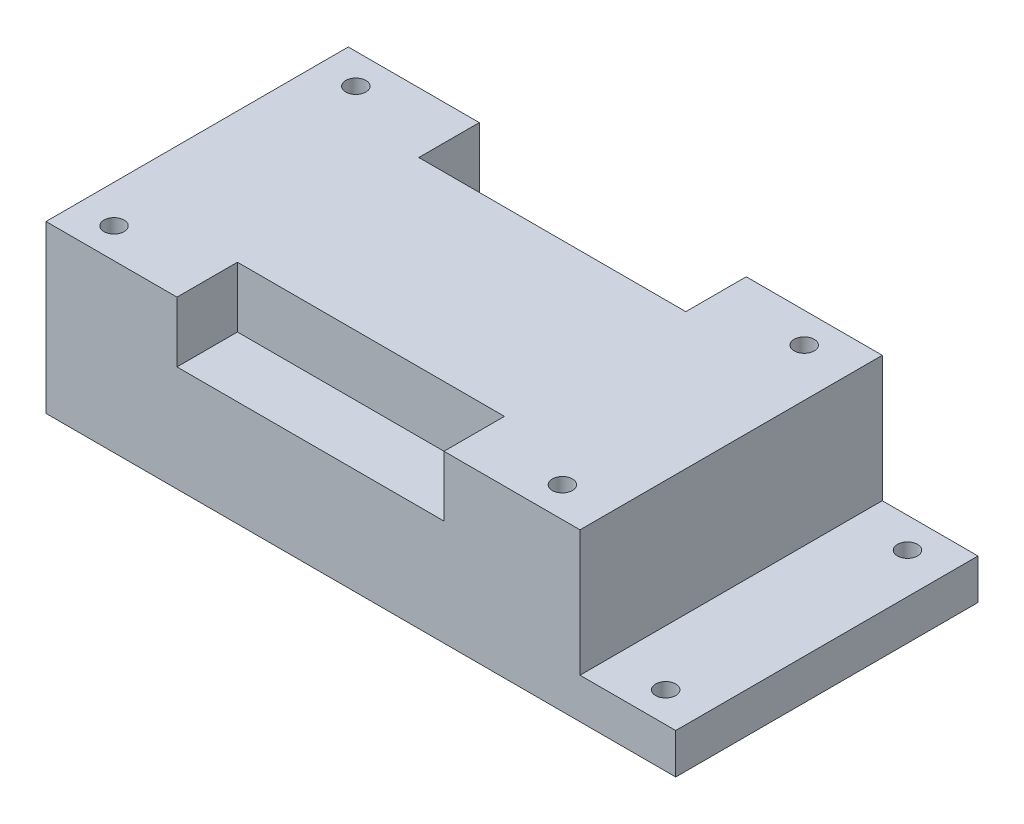
ISO-10303-21;
HEADER;
FILE_DESCRIPTION(('STEP AP214'),'2;1');
FILE_NAME('part.step','',(''),(''),'','','');
FILE_SCHEMA(('AUTOMOTIVE_DESIGN { 1 0 10303 214 1 1 1 1 }'));
ENDSEC;
DATA;
#1=APPLICATION_CONTEXT('core data for automotive mechanical design processes');
#2=APPLICATION_PROTOCOL_DEFINITION('international standard','automotive_design',2000,#1);
#3=PRODUCT_CONTEXT('',#1,'mechanical');
#4=PRODUCT('Part','Part','',(#3));
#5=PRODUCT_RELATED_PRODUCT_CATEGORY('part','',(#4));
#6=PRODUCT_DEFINITION_FORMATION('','',#4);
#7=PRODUCT_DEFINITION_CONTEXT('part definition',#1,'design');
#8=PRODUCT_DEFINITION('design','',#6,#7);
#9=PRODUCT_DEFINITION_SHAPE('','',#8);
#10=(LENGTH_UNIT() NAMED_UNIT(*) SI_UNIT(.MILLI.,.METRE.));
#11=(NAMED_UNIT(*) PLANE_ANGLE_UNIT() SI_UNIT($,.RADIAN.));
#12=(NAMED_UNIT(*) SI_UNIT($,.STERADIAN.) SOLID_ANGLE_UNIT());
#13=UNCERTAINTY_MEASURE_WITH_UNIT(LENGTH_MEASURE(1.E-05),#10,'distance_accuracy_value','');
#14=(GEOMETRIC_REPRESENTATION_CONTEXT(3) GLOBAL_UNCERTAINTY_ASSIGNED_CONTEXT((#13)) GLOBAL_UNIT_ASSIGNED_CONTEXT((#10,
#11,#12)) REPRESENTATION_CONTEXT('',''));
#15=CARTESIAN_POINT('',(0.,0.,0.));
#16=DIRECTION('',(0.,0.,1.));
#17=DIRECTION('',(1.,0.,0.));
#18=AXIS2_PLACEMENT_3D('',#15,#16,#17);
#19=CARTESIAN_POINT('',(16.5,33.,0.));
#20=DIRECTION('',(-1.,0.,0.));
#21=DIRECTION('',(0.,0.,1.));
#22=AXIS2_PLACEMENT_3D('',#19,#20,#21);
#23=PLANE('',#22);
#24=DIRECTION('',(0.,0.,-1.));
#25=VECTOR('',#24,1.);
#26=CARTESIAN_POINT('',(16.5,21.,0.));
#27=LINE('',#26,#25);
#28=CARTESIAN_POINT('',(16.5,21.,-18.));
#29=VERTEX_POINT('',#28);
#30=CARTESIAN_POINT('',(16.5,21.,-30.));
#31=VERTEX_POINT('',#30);
#32=EDGE_CURVE('E72',#29,#31,#27,.T.);
#33=ORIENTED_EDGE('',*,*,#32,.F.);
#34=DIRECTION('',(0.,-1.,0.));
#35=VECTOR('',#34,1.);
#36=CARTESIAN_POINT('',(16.5,33.,-18.));
#37=LINE('',#36,#35);
#38=CARTESIAN_POINT('',(16.5,33.,-18.));
#39=VERTEX_POINT('',#38);
#40=EDGE_CURVE('E11',#39,#29,#37,.T.);
#41=ORIENTED_EDGE('',*,*,#40,.F.);
#42=DIRECTION('',(0.,0.,-1.));
#43=VECTOR('',#42,1.);
#44=CARTESIAN_POINT('',(16.5,33.,0.));
#45=LINE('',#44,#43);
#46=CARTESIAN_POINT('',(16.5,33.,-30.));
#47=VERTEX_POINT('',#46);
#48=EDGE_CURVE('E226',#39,#47,#45,.T.);
#49=ORIENTED_EDGE('',*,*,#48,.T.);
#50=DIRECTION('',(0.,-1.,0.));
#51=VECTOR('',#50,1.);
#52=CARTESIAN_POINT('',(16.5,33.,-30.));
#53=LINE('',#52,#51);
#54=EDGE_CURVE('E294',#47,#31,#53,.T.);
#55=ORIENTED_EDGE('',*,*,#54,.T.);
#56=EDGE_LOOP('',(#33,#41,#49,#55));
#57=FACE_BOUND('',#56,.T.);
#58=ADVANCED_FACE('F50',(#57),#23,.T.);
#59=CARTESIAN_POINT('',(0.,33.,-18.));
#60=DIRECTION('',(0.,0.,-1.));
#61=DIRECTION('',(-1.,0.,0.));
#62=AXIS2_PLACEMENT_3D('',#59,#60,#61);
#63=PLANE('',#62);
#64=DIRECTION('',(1.,0.,0.));
#65=VECTOR('',#64,1.);
#66=CARTESIAN_POINT('',(0.,21.,-18.));
#67=LINE('',#66,#65);
#68=CARTESIAN_POINT('',(-36.5,21.,-18.));
#69=VERTEX_POINT('',#68);
#70=EDGE_CURVE('E177',#69,#29,#67,.T.);
#71=ORIENTED_EDGE('',*,*,#70,.F.);
#72=DIRECTION('',(0.,-1.,0.));
#73=VECTOR('',#72,1.);
#74=CARTESIAN_POINT('',(-36.5,33.,-18.));
#75=LINE('',#74,#73);
#76=CARTESIAN_POINT('',(-36.5,33.,-18.));
#77=VERTEX_POINT('',#76);
#78=EDGE_CURVE('E57',#77,#69,#75,.T.);
#79=ORIENTED_EDGE('',*,*,#78,.F.);
#80=DIRECTION('',(1.,0.,0.));
#81=VECTOR('',#80,1.);
#82=CARTESIAN_POINT('',(0.,33.,-18.));
#83=LINE('',#82,#81);
#84=EDGE_CURVE('E233',#77,#39,#83,.T.);
#85=ORIENTED_EDGE('',*,*,#84,.T.);
#86=ORIENTED_EDGE('',*,*,#40,.T.);
#87=EDGE_LOOP('',(#71,#79,#85,#86));
#88=FACE_BOUND('',#87,.T.);
#89=ADVANCED_FACE('F337',(#88),#63,.T.);
#90=CARTESIAN_POINT('',(-36.5,33.,0.));
#91=DIRECTION('',(1.,0.,0.));
#92=DIRECTION('',(0.,0.,-1.));
#93=AXIS2_PLACEMENT_3D('',#90,#91,#92);
#94=PLANE('',#93);
#95=DIRECTION('',(0.,0.,1.));
#96=VECTOR('',#95,1.);
#97=CARTESIAN_POINT('',(-36.5,21.,0.));
#98=LINE('',#97,#96);
#99=CARTESIAN_POINT('',(-36.5,21.,-30.));
#100=VERTEX_POINT('',#99);
#101=EDGE_CURVE('E192',#100,#69,#98,.T.);
#102=ORIENTED_EDGE('',*,*,#101,.F.);
#103=DIRECTION('',(0.,-1.,0.));
#104=VECTOR('',#103,1.);
#105=CARTESIAN_POINT('',(-36.5,33.,-30.));
#106=LINE('',#105,#104);
#107=CARTESIAN_POINT('',(-36.5,33.,-30.));
#108=VERTEX_POINT('',#107);
#109=EDGE_CURVE('E326',#108,#100,#106,.T.);
#110=ORIENTED_EDGE('',*,*,#109,.F.);
#111=DIRECTION('',(0.,0.,1.));
#112=VECTOR('',#111,1.);
#113=CARTESIAN_POINT('',(-36.5,33.,0.));
#114=LINE('',#113,#112);
#115=EDGE_CURVE('E240',#108,#77,#114,.T.);
#116=ORIENTED_EDGE('',*,*,#115,.T.);
#117=ORIENTED_EDGE('',*,*,#78,.T.);
#118=EDGE_LOOP('',(#102,#110,#116,#117));
#119=FACE_BOUND('',#118,.T.);
#120=ADVANCED_FACE('F335',(#119),#94,.T.);
#121=CARTESIAN_POINT('',(-62.5,33.,0.));
#122=DIRECTION('',(-1.,0.,0.));
#123=DIRECTION('',(0.,0.,1.));
#124=AXIS2_PLACEMENT_3D('',#121,#122,#123);
#125=PLANE('',#124);
#126=DIRECTION('',(0.,0.,-1.));
#127=VECTOR('',#126,1.);
#128=CARTESIAN_POINT('',(-62.5,0.,0.));
#129=LINE('',#128,#127);
#130=CARTESIAN_POINT('',(-62.5,0.,30.));
#131=VERTEX_POINT('',#130);
#132=CARTESIAN_POINT('',(-62.5,0.,-30.));
#133=VERTEX_POINT('',#132);
#134=EDGE_CURVE('E287',#131,#133,#129,.T.);
#135=ORIENTED_EDGE('',*,*,#134,.F.);
#136=DIRECTION('',(0.,-1.,0.));
#137=VECTOR('',#136,1.);
#138=CARTESIAN_POINT('',(-62.5,33.,30.));
#139=LINE('',#138,#137);
#140=CARTESIAN_POINT('',(-62.5,33.,30.));
#141=VERTEX_POINT('',#140);
#142=EDGE_CURVE('E317',#141,#131,#139,.T.);
#143=ORIENTED_EDGE('',*,*,#142,.F.);
#144=DIRECTION('',(0.,0.,-1.));
#145=VECTOR('',#144,1.);
#146=CARTESIAN_POINT('',(-62.5,33.,0.));
#147=LINE('',#146,#145);
#148=CARTESIAN_POINT('',(-62.5,33.,-30.));
#149=VERTEX_POINT('',#148);
#150=EDGE_CURVE('E243',#141,#149,#147,.T.);
#151=ORIENTED_EDGE('',*,*,#150,.T.);
#152=DIRECTION('',(0.,-1.,0.));
#153=VECTOR('',#152,1.);
#154=CARTESIAN_POINT('',(-62.5,33.,-30.));
#155=LINE('',#154,#153);
#156=EDGE_CURVE('E325',#149,#133,#155,.T.);
#157=ORIENTED_EDGE('',*,*,#156,.T.);
#158=EDGE_LOOP('',(#135,#143,#151,#157));
#159=FACE_BOUND('',#158,.T.);
#160=ADVANCED_FACE('F427',(#159),#125,.T.);
#161=CARTESIAN_POINT('',(-36.5,33.,0.));
#162=DIRECTION('',(-1.,0.,0.));
#163=DIRECTION('',(0.,0.,1.));
#164=AXIS2_PLACEMENT_3D('',#161,#162,#163);
#165=PLANE('',#164);
#166=DIRECTION('',(0.,-1.,0.));
#167=VECTOR('',#166,1.);
#168=CARTESIAN_POINT('',(-36.5,33.,30.));
#169=LINE('',#168,#167);
#170=CARTESIAN_POINT('',(-36.5,33.,30.));
#171=VERTEX_POINT('',#170);
#172=CARTESIAN_POINT('',(-36.5,21.,30.));
#173=VERTEX_POINT('',#172);
#174=EDGE_CURVE('E312',#171,#173,#169,.T.);
#175=ORIENTED_EDGE('',*,*,#174,.T.);
#176=DIRECTION('',(0.,0.,-1.));
#177=VECTOR('',#176,1.);
#178=CARTESIAN_POINT('',(-36.5,21.,0.));
#179=LINE('',#178,#177);
#180=CARTESIAN_POINT('',(-36.5,21.,18.));
#181=VERTEX_POINT('',#180);
#182=EDGE_CURVE('E191',#173,#181,#179,.T.);
#183=ORIENTED_EDGE('',*,*,#182,.T.);
#184=DIRECTION('',(0.,-1.,0.));
#185=VECTOR('',#184,1.);
#186=CARTESIAN_POINT('',(-36.5,33.,18.));
#187=LINE('',#186,#185);
#188=CARTESIAN_POINT('',(-36.5,33.,18.));
#189=VERTEX_POINT('',#188);
#190=EDGE_CURVE('E313',#189,#181,#187,.T.);
#191=ORIENTED_EDGE('',*,*,#190,.F.);
#192=DIRECTION('',(0.,0.,-1.));
#193=VECTOR('',#192,1.);
#194=CARTESIAN_POINT('',(-36.5,33.,0.));
#195=LINE('',#194,#193);
#196=EDGE_CURVE('E255',#171,#189,#195,.T.);
#197=ORIENTED_EDGE('',*,*,#196,.F.);
#198=EDGE_LOOP('',(#175,#183,#191,#197));
#199=FACE_BOUND('',#198,.T.);
#200=ADVANCED_FACE('F422',(#199),#165,.F.);
#201=CARTESIAN_POINT('',(0.,33.,18.));
#202=DIRECTION('',(0.,0.,-1.));
#203=DIRECTION('',(-1.,0.,0.));
#204=AXIS2_PLACEMENT_3D('',#201,#202,#203);
#205=PLANE('',#204);
#206=ORIENTED_EDGE('',*,*,#190,.T.);
#207=DIRECTION('',(1.,0.,0.));
#208=VECTOR('',#207,1.);
#209=CARTESIAN_POINT('',(0.,21.,18.));
#210=LINE('',#209,#208);
#211=CARTESIAN_POINT('',(16.5,21.,18.));
#212=VERTEX_POINT('',#211);
#213=EDGE_CURVE('E188',#181,#212,#210,.T.);
#214=ORIENTED_EDGE('',*,*,#213,.T.);
#215=DIRECTION('',(0.,-1.,0.));
#216=VECTOR('',#215,1.);
#217=CARTESIAN_POINT('',(16.5,33.,18.));
#218=LINE('',#217,#216);
#219=CARTESIAN_POINT('',(16.5,33.,18.));
#220=VERTEX_POINT('',#219);
#221=EDGE_CURVE('E307',#220,#212,#218,.T.);
#222=ORIENTED_EDGE('',*,*,#221,.F.);
#223=DIRECTION('',(1.,0.,0.));
#224=VECTOR('',#223,1.);
#225=CARTESIAN_POINT('',(0.,33.,18.));
#226=LINE('',#225,#224);
#227=EDGE_CURVE('E259',#189,#220,#226,.T.);
#228=ORIENTED_EDGE('',*,*,#227,.F.);
#229=EDGE_LOOP('',(#206,#214,#222,#228));
#230=FACE_BOUND('',#229,.T.);
#231=ADVANCED_FACE('F425',(#230),#205,.F.);
#232=CARTESIAN_POINT('',(16.5,33.,0.));
#233=DIRECTION('',(1.,0.,0.));
#234=DIRECTION('',(0.,0.,-1.));
#235=AXIS2_PLACEMENT_3D('',#232,#233,#234);
#236=PLANE('',#235);
#237=ORIENTED_EDGE('',*,*,#221,.T.);
#238=DIRECTION('',(0.,0.,1.));
#239=VECTOR('',#238,1.);
#240=CARTESIAN_POINT('',(16.5,21.,0.));
#241=LINE('',#240,#239);
#242=CARTESIAN_POINT('',(16.5,21.,30.));
#243=VERTEX_POINT('',#242);
#244=EDGE_CURVE('E187',#212,#243,#241,.T.);
#245=ORIENTED_EDGE('',*,*,#244,.T.);
#246=DIRECTION('',(0.,-1.,0.));
#247=VECTOR('',#246,1.);
#248=CARTESIAN_POINT('',(16.5,33.,30.));
#249=LINE('',#248,#247);
#250=CARTESIAN_POINT('',(16.5,33.,30.));
#251=VERTEX_POINT('',#250);
#252=EDGE_CURVE('E303',#251,#243,#249,.T.);
#253=ORIENTED_EDGE('',*,*,#252,.F.);
#254=DIRECTION('',(0.,0.,1.));
#255=VECTOR('',#254,1.);
#256=CARTESIAN_POINT('',(16.5,33.,0.));
#257=LINE('',#256,#255);
#258=EDGE_CURVE('E263',#220,#251,#257,.T.);
#259=ORIENTED_EDGE('',*,*,#258,.F.);
#260=EDGE_LOOP('',(#237,#245,#253,#259));
#261=FACE_BOUND('',#260,.T.);
#262=ADVANCED_FACE('F416',(#261),#236,.F.);
#263=CARTESIAN_POINT('',(0.,33.,30.));
#264=DIRECTION('',(0.,0.,-1.));
#265=DIRECTION('',(-1.,0.,0.));
#266=AXIS2_PLACEMENT_3D('',#263,#264,#265);
#267=PLANE('',#266);
#268=DIRECTION('',(1.,0.,0.));
#269=VECTOR('',#268,1.);
#270=CARTESIAN_POINT('',(0.,0.,30.));
#271=LINE('',#270,#269);
#272=CARTESIAN_POINT('',(62.5,0.,30.));
#273=VERTEX_POINT('',#272);
#274=EDGE_CURVE('E174',#131,#273,#271,.T.);
#275=ORIENTED_EDGE('',*,*,#274,.T.);
#276=DIRECTION('',(0.,-1.,0.));
#277=VECTOR('',#276,1.);
#278=CARTESIAN_POINT('',(62.5,8.,30.));
#279=LINE('',#278,#277);
#280=CARTESIAN_POINT('',(62.5,8.,30.));
#281=VERTEX_POINT('',#280);
#282=EDGE_CURVE('E153',#281,#273,#279,.T.);
#283=ORIENTED_EDGE('',*,*,#282,.F.);
#284=DIRECTION('',(1.,0.,0.));
#285=VECTOR('',#284,1.);
#286=CARTESIAN_POINT('',(0.,8.,30.));
#287=LINE('',#286,#285);
#288=CARTESIAN_POINT('',(43.5,8.,30.));
#289=VERTEX_POINT('',#288);
#290=EDGE_CURVE('E161',#289,#281,#287,.T.);
#291=ORIENTED_EDGE('',*,*,#290,.F.);
#292=DIRECTION('',(0.,-1.,0.));
#293=VECTOR('',#292,1.);
#294=CARTESIAN_POINT('',(43.5,33.,30.));
#295=LINE('',#294,#293);
#296=CARTESIAN_POINT('',(43.5,33.,30.));
#297=VERTEX_POINT('',#296);
#298=EDGE_CURVE('E298',#297,#289,#295,.T.);
#299=ORIENTED_EDGE('',*,*,#298,.F.);
#300=DIRECTION('',(1.,0.,0.));
#301=VECTOR('',#300,1.);
#302=CARTESIAN_POINT('',(0.,33.,30.));
#303=LINE('',#302,#301);
#304=EDGE_CURVE('E254',#251,#297,#303,.T.);
#305=ORIENTED_EDGE('',*,*,#304,.F.);
#306=ORIENTED_EDGE('',*,*,#252,.T.);
#307=DIRECTION('',(1.,0.,0.));
#308=VECTOR('',#307,1.);
#309=CARTESIAN_POINT('',(0.,21.,30.));
#310=LINE('',#309,#308);
#311=EDGE_CURVE('E200',#173,#243,#310,.T.);
#312=ORIENTED_EDGE('',*,*,#311,.F.);
#313=ORIENTED_EDGE('',*,*,#174,.F.);
#314=EDGE_CURVE('E246',#141,#171,#303,.T.);
#315=ORIENTED_EDGE('',*,*,#314,.F.);
#316=ORIENTED_EDGE('',*,*,#142,.T.);
#317=EDGE_LOOP('',(#275,#283,#291,#299,#305,#306,#312,#313,#315,#316));
#318=FACE_BOUND('',#317,.T.);
#319=ADVANCED_FACE('F172',(#318),#267,.F.);
#320=CARTESIAN_POINT('',(43.5,33.,0.));
#321=DIRECTION('',(1.,0.,0.));
#322=DIRECTION('',(0.,0.,-1.));
#323=AXIS2_PLACEMENT_3D('',#320,#321,#322);
#324=PLANE('',#323);
#325=DIRECTION('',(0.,0.,1.));
#326=VECTOR('',#325,1.);
#327=CARTESIAN_POINT('',(43.5,8.,0.));
#328=LINE('',#327,#326);
#329=CARTESIAN_POINT('',(43.5,8.,-30.));
#330=VERTEX_POINT('',#329);
#331=EDGE_CURVE('E64',#330,#289,#328,.T.);
#332=ORIENTED_EDGE('',*,*,#331,.F.);
#333=DIRECTION('',(0.,-1.,0.));
#334=VECTOR('',#333,1.);
#335=CARTESIAN_POINT('',(43.5,33.,-30.));
#336=LINE('',#335,#334);
#337=CARTESIAN_POINT('',(43.5,33.,-30.));
#338=VERTEX_POINT('',#337);
#339=EDGE_CURVE('E300',#338,#330,#336,.T.);
#340=ORIENTED_EDGE('',*,*,#339,.F.);
#341=DIRECTION('',(0.,0.,1.));
#342=VECTOR('',#341,1.);
#343=CARTESIAN_POINT('',(43.5,33.,0.));
#344=LINE('',#343,#342);
#345=EDGE_CURVE('E270',#338,#297,#344,.T.);
#346=ORIENTED_EDGE('',*,*,#345,.T.);
#347=ORIENTED_EDGE('',*,*,#298,.T.);
#348=EDGE_LOOP('',(#332,#340,#346,#347));
#349=FACE_BOUND('',#348,.T.);
#350=ADVANCED_FACE('F361',(#349),#324,.T.);
#351=CARTESIAN_POINT('',(34.,33.,24.));
#352=DIRECTION('',(0.,-1.,0.));
#353=DIRECTION('',(0.,0.,-1.));
#354=AXIS2_PLACEMENT_3D('',#351,#352,#353);
#355=CYLINDRICAL_SURFACE('',#354,2.);
#356=CARTESIAN_POINT('',(34.,33.,24.));
#357=DIRECTION('',(0.,1.,0.));
#358=DIRECTION('',(0.,0.,1.));
#359=AXIS2_PLACEMENT_3D('',#356,#357,#358);
#360=CIRCLE('',#359,2.);
#361=CARTESIAN_POINT('',(34.,33.,26.));
#362=VERTEX_POINT('',#361);
#363=EDGE_CURVE('E223',#362,#362,#360,.T.);
#364=ORIENTED_EDGE('',*,*,#363,.T.);
#365=EDGE_LOOP('',(#364));
#366=FACE_BOUND('',#365,.T.);
#367=CARTESIAN_POINT('',(34.,0.,24.));
#368=DIRECTION('',(0.,1.,0.));
#369=DIRECTION('',(0.,0.,1.));
#370=AXIS2_PLACEMENT_3D('',#367,#368,#369);
#371=CIRCLE('',#370,2.);
#372=CARTESIAN_POINT('',(34.,0.,26.));
#373=VERTEX_POINT('',#372);
#374=EDGE_CURVE('E285',#373,#373,#371,.T.);
#375=ORIENTED_EDGE('',*,*,#374,.F.);
#376=EDGE_LOOP('',(#375));
#377=FACE_BOUND('',#376,.T.);
#378=ADVANCED_FACE('F359',(#366,#377),#355,.F.);
#379=CARTESIAN_POINT('',(-55.,33.,24.));
#380=DIRECTION('',(0.,-1.,0.));
#381=DIRECTION('',(0.,0.,-1.));
#382=AXIS2_PLACEMENT_3D('',#379,#380,#381);
#383=CYLINDRICAL_SURFACE('',#382,2.);
#384=CARTESIAN_POINT('',(-55.,33.,24.));
#385=DIRECTION('',(0.,1.,0.));
#386=DIRECTION('',(0.,0.,1.));
#387=AXIS2_PLACEMENT_3D('',#384,#385,#386);
#388=CIRCLE('',#387,2.);
#389=CARTESIAN_POINT('',(-55.,33.,26.));
#390=VERTEX_POINT('',#389);
#391=EDGE_CURVE('E222',#390,#390,#388,.T.);
#392=ORIENTED_EDGE('',*,*,#391,.T.);
#393=EDGE_LOOP('',(#392));
#394=FACE_BOUND('',#393,.T.);
#395=CARTESIAN_POINT('',(-55.,0.,24.));
#396=DIRECTION('',(0.,1.,0.));
#397=DIRECTION('',(0.,0.,1.));
#398=AXIS2_PLACEMENT_3D('',#395,#396,#397);
#399=CIRCLE('',#398,2.);
#400=CARTESIAN_POINT('',(-55.,0.,26.));
#401=VERTEX_POINT('',#400);
#402=EDGE_CURVE('E279',#401,#401,#399,.T.);
#403=ORIENTED_EDGE('',*,*,#402,.F.);
#404=EDGE_LOOP('',(#403));
#405=FACE_BOUND('',#404,.T.);
#406=ADVANCED_FACE('F362',(#394,#405),#383,.F.);
#407=CARTESIAN_POINT('',(-55.,33.,-24.));
#408=DIRECTION('',(0.,-1.,0.));
#409=DIRECTION('',(0.,0.,-1.));
#410=AXIS2_PLACEMENT_3D('',#407,#408,#409);
#411=CYLINDRICAL_SURFACE('',#410,2.);
#412=CARTESIAN_POINT('',(-55.,33.,-24.));
#413=DIRECTION('',(0.,1.,0.));
#414=DIRECTION('',(0.,0.,1.));
#415=AXIS2_PLACEMENT_3D('',#412,#413,#414);
#416=CIRCLE('',#415,2.);
#417=CARTESIAN_POINT('',(-55.,33.,-22.));
#418=VERTEX_POINT('',#417);
#419=EDGE_CURVE('E216',#418,#418,#416,.T.);
#420=ORIENTED_EDGE('',*,*,#419,.T.);
#421=EDGE_LOOP('',(#420));
#422=FACE_BOUND('',#421,.T.);
#423=CARTESIAN_POINT('',(-55.,0.,-24.));
#424=DIRECTION('',(0.,1.,0.));
#425=DIRECTION('',(0.,0.,1.));
#426=AXIS2_PLACEMENT_3D('',#423,#424,#425);
#427=CIRCLE('',#426,2.);
#428=CARTESIAN_POINT('',(-55.,0.,-22.));
#429=VERTEX_POINT('',#428);
#430=EDGE_CURVE('E273',#429,#429,#427,.T.);
#431=ORIENTED_EDGE('',*,*,#430,.F.);
#432=EDGE_LOOP('',(#431));
#433=FACE_BOUND('',#432,.T.);
#434=ADVANCED_FACE('F368',(#422,#433),#411,.F.);
#435=CARTESIAN_POINT('',(34.,33.,-24.));
#436=DIRECTION('',(0.,-1.,0.));
#437=DIRECTION('',(0.,0.,-1.));
#438=AXIS2_PLACEMENT_3D('',#435,#436,#437);
#439=CYLINDRICAL_SURFACE('',#438,2.);
#440=CARTESIAN_POINT('',(34.,33.,-24.));
#441=DIRECTION('',(0.,1.,0.));
#442=DIRECTION('',(0.,0.,1.));
#443=AXIS2_PLACEMENT_3D('',#440,#441,#442);
#444=CIRCLE('',#443,2.);
#445=CARTESIAN_POINT('',(34.,33.,-22.));
#446=VERTEX_POINT('',#445);
#447=EDGE_CURVE('E215',#446,#446,#444,.T.);
#448=ORIENTED_EDGE('',*,*,#447,.T.);
#449=EDGE_LOOP('',(#448));
#450=FACE_BOUND('',#449,.T.);
#451=CARTESIAN_POINT('',(34.,0.,-24.));
#452=DIRECTION('',(0.,1.,0.));
#453=DIRECTION('',(0.,0.,1.));
#454=AXIS2_PLACEMENT_3D('',#451,#452,#453);
#455=CIRCLE('',#454,2.);
#456=CARTESIAN_POINT('',(34.,0.,-22.));
#457=VERTEX_POINT('',#456);
#458=EDGE_CURVE('E203',#457,#457,#455,.T.);
#459=ORIENTED_EDGE('',*,*,#458,.F.);
#460=EDGE_LOOP('',(#459));
#461=FACE_BOUND('',#460,.T.);
#462=ADVANCED_FACE('F47',(#450,#461),#439,.F.);
#463=CARTESIAN_POINT('',(0.,33.,-30.));
#464=DIRECTION('',(0.,0.,-1.));
#465=DIRECTION('',(-1.,0.,0.));
#466=AXIS2_PLACEMENT_3D('',#463,#464,#465);
#467=PLANE('',#466);
#468=DIRECTION('',(1.,0.,0.));
#469=VECTOR('',#468,1.);
#470=CARTESIAN_POINT('',(0.,0.,-30.));
#471=LINE('',#470,#469);
#472=CARTESIAN_POINT('',(62.5,0.,-30.));
#473=VERTEX_POINT('',#472);
#474=EDGE_CURVE('E220',#133,#473,#471,.T.);
#475=ORIENTED_EDGE('',*,*,#474,.F.);
#476=ORIENTED_EDGE('',*,*,#156,.F.);
#477=DIRECTION('',(1.,0.,0.));
#478=VECTOR('',#477,1.);
#479=CARTESIAN_POINT('',(0.,33.,-30.));
#480=LINE('',#479,#478);
#481=EDGE_CURVE('E242',#149,#108,#480,.T.);
#482=ORIENTED_EDGE('',*,*,#481,.T.);
#483=ORIENTED_EDGE('',*,*,#109,.T.);
#484=DIRECTION('',(1.,0.,0.));
#485=VECTOR('',#484,1.);
#486=CARTESIAN_POINT('',(0.,21.,-30.));
#487=LINE('',#486,#485);
#488=EDGE_CURVE('E202',#100,#31,#487,.T.);
#489=ORIENTED_EDGE('',*,*,#488,.T.);
#490=ORIENTED_EDGE('',*,*,#54,.F.);
#491=EDGE_CURVE('E247',#47,#338,#480,.T.);
#492=ORIENTED_EDGE('',*,*,#491,.T.);
#493=ORIENTED_EDGE('',*,*,#339,.T.);
#494=DIRECTION('',(1.,0.,0.));
#495=VECTOR('',#494,1.);
#496=CARTESIAN_POINT('',(0.,8.,-30.));
#497=LINE('',#496,#495);
#498=CARTESIAN_POINT('',(62.5,8.,-30.));
#499=VERTEX_POINT('',#498);
#500=EDGE_CURVE('E159',#330,#499,#497,.T.);
#501=ORIENTED_EDGE('',*,*,#500,.T.);
#502=DIRECTION('',(0.,-1.,0.));
#503=VECTOR('',#502,1.);
#504=CARTESIAN_POINT('',(62.5,8.,-30.));
#505=LINE('',#504,#503);
#506=EDGE_CURVE('E154',#499,#473,#505,.T.);
#507=ORIENTED_EDGE('',*,*,#506,.T.);
#508=EDGE_LOOP('',(#475,#476,#482,#483,#489,#490,#492,#493,#501,#507));
#509=FACE_BOUND('',#508,.T.);
#510=ADVANCED_FACE('F342',(#509),#467,.T.);
#511=CARTESIAN_POINT('',(0.,33.,0.));
#512=DIRECTION('',(0.,1.,0.));
#513=DIRECTION('',(0.,0.,1.));
#514=AXIS2_PLACEMENT_3D('',#511,#512,#513);
#515=PLANE('',#514);
#516=ORIENTED_EDGE('',*,*,#447,.F.);
#517=EDGE_LOOP('',(#516));
#518=FACE_BOUND('',#517,.T.);
#519=ORIENTED_EDGE('',*,*,#419,.F.);
#520=EDGE_LOOP('',(#519));
#521=FACE_BOUND('',#520,.T.);
#522=ORIENTED_EDGE('',*,*,#391,.F.);
#523=EDGE_LOOP('',(#522));
#524=FACE_BOUND('',#523,.T.);
#525=ORIENTED_EDGE('',*,*,#363,.F.);
#526=EDGE_LOOP('',(#525));
#527=FACE_BOUND('',#526,.T.);
#528=ORIENTED_EDGE('',*,*,#48,.F.);
#529=ORIENTED_EDGE('',*,*,#84,.F.);
#530=ORIENTED_EDGE('',*,*,#115,.F.);
#531=ORIENTED_EDGE('',*,*,#481,.F.);
#532=ORIENTED_EDGE('',*,*,#150,.F.);
#533=ORIENTED_EDGE('',*,*,#314,.T.);
#534=ORIENTED_EDGE('',*,*,#196,.T.);
#535=ORIENTED_EDGE('',*,*,#227,.T.);
#536=ORIENTED_EDGE('',*,*,#258,.T.);
#537=ORIENTED_EDGE('',*,*,#304,.T.);
#538=ORIENTED_EDGE('',*,*,#345,.F.);
#539=ORIENTED_EDGE('',*,*,#491,.F.);
#540=EDGE_LOOP('',(#528,#529,#530,#531,#532,#533,#534,#535,#536,#537,#538,#539));
#541=FACE_BOUND('',#540,.T.);
#542=ADVANCED_FACE('F347',(#518,#521,#524,#527,#541),#515,.T.);
#543=CARTESIAN_POINT('',(0.,0.,0.));
#544=DIRECTION('',(0.,1.,0.));
#545=DIRECTION('',(0.,0.,1.));
#546=AXIS2_PLACEMENT_3D('',#543,#544,#545);
#547=PLANE('',#546);
#548=ORIENTED_EDGE('',*,*,#134,.T.);
#549=ORIENTED_EDGE('',*,*,#474,.T.);
#550=DIRECTION('',(0.,0.,-1.));
#551=VECTOR('',#550,1.);
#552=CARTESIAN_POINT('',(62.5,0.,0.));
#553=LINE('',#552,#551);
#554=EDGE_CURVE('E400',#273,#473,#553,.T.);
#555=ORIENTED_EDGE('',*,*,#554,.F.);
#556=ORIENTED_EDGE('',*,*,#274,.F.);
#557=EDGE_LOOP('',(#548,#549,#555,#556));
#558=FACE_BOUND('',#557,.T.);
#559=ORIENTED_EDGE('',*,*,#458,.T.);
#560=EDGE_LOOP('',(#559));
#561=FACE_BOUND('',#560,.T.);
#562=ORIENTED_EDGE('',*,*,#430,.T.);
#563=EDGE_LOOP('',(#562));
#564=FACE_BOUND('',#563,.T.);
#565=ORIENTED_EDGE('',*,*,#402,.T.);
#566=EDGE_LOOP('',(#565));
#567=FACE_BOUND('',#566,.T.);
#568=ORIENTED_EDGE('',*,*,#374,.T.);
#569=EDGE_LOOP('',(#568));
#570=FACE_BOUND('',#569,.T.);
#571=CARTESIAN_POINT('',(54.5,0.,-24.));
#572=DIRECTION('',(0.,1.,0.));
#573=DIRECTION('',(0.,0.,1.));
#574=AXIS2_PLACEMENT_3D('',#571,#572,#573);
#575=CIRCLE('',#574,2.);
#576=CARTESIAN_POINT('',(54.5,0.,-22.));
#577=VERTEX_POINT('',#576);
#578=EDGE_CURVE('E392',#577,#577,#575,.T.);
#579=ORIENTED_EDGE('',*,*,#578,.T.);
#580=EDGE_LOOP('',(#579));
#581=FACE_BOUND('',#580,.T.);
#582=CARTESIAN_POINT('',(54.5,0.,24.));
#583=DIRECTION('',(0.,1.,0.));
#584=DIRECTION('',(0.,0.,1.));
#585=AXIS2_PLACEMENT_3D('',#582,#583,#584);
#586=CIRCLE('',#585,2.);
#587=CARTESIAN_POINT('',(54.5,0.,26.));
#588=VERTEX_POINT('',#587);
#589=EDGE_CURVE('E391',#588,#588,#586,.T.);
#590=ORIENTED_EDGE('',*,*,#589,.T.);
#591=EDGE_LOOP('',(#590));
#592=FACE_BOUND('',#591,.T.);
#593=ADVANCED_FACE('F378',(#558,#561,#564,#567,#570,#581,#592),#547,.F.);
#594=CARTESIAN_POINT('',(0.,21.,0.));
#595=DIRECTION('',(0.,1.,0.));
#596=DIRECTION('',(0.,0.,1.));
#597=AXIS2_PLACEMENT_3D('',#594,#595,#596);
#598=PLANE('',#597);
#599=ORIENTED_EDGE('',*,*,#244,.F.);
#600=ORIENTED_EDGE('',*,*,#213,.F.);
#601=ORIENTED_EDGE('',*,*,#182,.F.);
#602=ORIENTED_EDGE('',*,*,#311,.T.);
#603=EDGE_LOOP('',(#599,#600,#601,#602));
#604=FACE_BOUND('',#603,.T.);
#605=ADVANCED_FACE('F381',(#604),#598,.T.);
#606=CARTESIAN_POINT('',(0.,21.,0.));
#607=DIRECTION('',(0.,1.,0.));
#608=DIRECTION('',(0.,0.,1.));
#609=AXIS2_PLACEMENT_3D('',#606,#607,#608);
#610=PLANE('',#609);
#611=ORIENTED_EDGE('',*,*,#70,.T.);
#612=ORIENTED_EDGE('',*,*,#32,.T.);
#613=ORIENTED_EDGE('',*,*,#488,.F.);
#614=ORIENTED_EDGE('',*,*,#101,.T.);
#615=EDGE_LOOP('',(#611,#612,#613,#614));
#616=FACE_BOUND('',#615,.T.);
#617=ADVANCED_FACE('F336',(#616),#610,.T.);
#618=CARTESIAN_POINT('',(62.5,8.,0.));
#619=DIRECTION('',(-1.,0.,0.));
#620=DIRECTION('',(0.,0.,1.));
#621=AXIS2_PLACEMENT_3D('',#618,#619,#620);
#622=PLANE('',#621);
#623=ORIENTED_EDGE('',*,*,#554,.T.);
#624=ORIENTED_EDGE('',*,*,#506,.F.);
#625=DIRECTION('',(0.,0.,-1.));
#626=VECTOR('',#625,1.);
#627=CARTESIAN_POINT('',(62.5,8.,0.));
#628=LINE('',#627,#626);
#629=EDGE_CURVE('E146',#281,#499,#628,.T.);
#630=ORIENTED_EDGE('',*,*,#629,.F.);
#631=ORIENTED_EDGE('',*,*,#282,.T.);
#632=EDGE_LOOP('',(#623,#624,#630,#631));
#633=FACE_BOUND('',#632,.T.);
#634=ADVANCED_FACE('F151',(#633),#622,.F.);
#635=CARTESIAN_POINT('',(54.5,8.,-24.));
#636=DIRECTION('',(0.,-1.,0.));
#637=DIRECTION('',(0.,0.,-1.));
#638=AXIS2_PLACEMENT_3D('',#635,#636,#637);
#639=CYLINDRICAL_SURFACE('',#638,2.);
#640=CARTESIAN_POINT('',(54.5,8.,-24.));
#641=DIRECTION('',(0.,1.,0.));
#642=DIRECTION('',(0.,0.,1.));
#643=AXIS2_PLACEMENT_3D('',#640,#641,#642);
#644=CIRCLE('',#643,2.);
#645=CARTESIAN_POINT('',(54.5,8.,-22.));
#646=VERTEX_POINT('',#645);
#647=EDGE_CURVE('E166',#646,#646,#644,.T.);
#648=ORIENTED_EDGE('',*,*,#647,.T.);
#649=EDGE_LOOP('',(#648));
#650=FACE_BOUND('',#649,.T.);
#651=ORIENTED_EDGE('',*,*,#578,.F.);
#652=EDGE_LOOP('',(#651));
#653=FACE_BOUND('',#652,.T.);
#654=ADVANCED_FACE('F460',(#650,#653),#639,.F.);
#655=CARTESIAN_POINT('',(54.5,8.,24.));
#656=DIRECTION('',(0.,-1.,0.));
#657=DIRECTION('',(0.,0.,-1.));
#658=AXIS2_PLACEMENT_3D('',#655,#656,#657);
#659=CYLINDRICAL_SURFACE('',#658,2.);
#660=CARTESIAN_POINT('',(54.5,8.,24.));
#661=DIRECTION('',(0.,1.,0.));
#662=DIRECTION('',(0.,0.,1.));
#663=AXIS2_PLACEMENT_3D('',#660,#661,#662);
#664=CIRCLE('',#663,2.);
#665=CARTESIAN_POINT('',(54.5,8.,26.));
#666=VERTEX_POINT('',#665);
#667=EDGE_CURVE('E185',#666,#666,#664,.T.);
#668=ORIENTED_EDGE('',*,*,#667,.T.);
#669=EDGE_LOOP('',(#668));
#670=FACE_BOUND('',#669,.T.);
#671=ORIENTED_EDGE('',*,*,#589,.F.);
#672=EDGE_LOOP('',(#671));
#673=FACE_BOUND('',#672,.T.);
#674=ADVANCED_FACE('F458',(#670,#673),#659,.F.);
#675=CARTESIAN_POINT('',(0.,8.,0.));
#676=DIRECTION('',(0.,1.,0.));
#677=DIRECTION('',(0.,0.,1.));
#678=AXIS2_PLACEMENT_3D('',#675,#676,#677);
#679=PLANE('',#678);
#680=ORIENTED_EDGE('',*,*,#647,.F.);
#681=EDGE_LOOP('',(#680));
#682=FACE_BOUND('',#681,.T.);
#683=ORIENTED_EDGE('',*,*,#290,.T.);
#684=ORIENTED_EDGE('',*,*,#629,.T.);
#685=ORIENTED_EDGE('',*,*,#500,.F.);
#686=ORIENTED_EDGE('',*,*,#331,.T.);
#687=EDGE_LOOP('',(#683,#684,#685,#686));
#688=FACE_BOUND('',#687,.T.);
#689=ORIENTED_EDGE('',*,*,#667,.F.);
#690=EDGE_LOOP('',(#689));
#691=FACE_BOUND('',#690,.T.);
#692=ADVANCED_FACE('F163',(#682,#688,#691),#679,.T.);
#693=CLOSED_SHELL('',(#58,#89,#120,#160,#200,#231,#262,#319,#350,#378,#406,#434,#462,#510,#542,
#593,#605,#617,#634,#654,#674,#692));
#694=MANIFOLD_SOLID_BREP('B2',#693);
#695=ADVANCED_BREP_SHAPE_REPRESENTATION('',(#18,#694),#14);
#696=SHAPE_DEFINITION_REPRESENTATION(#9,#695);
ENDSEC;
END-ISO-10303-21;
